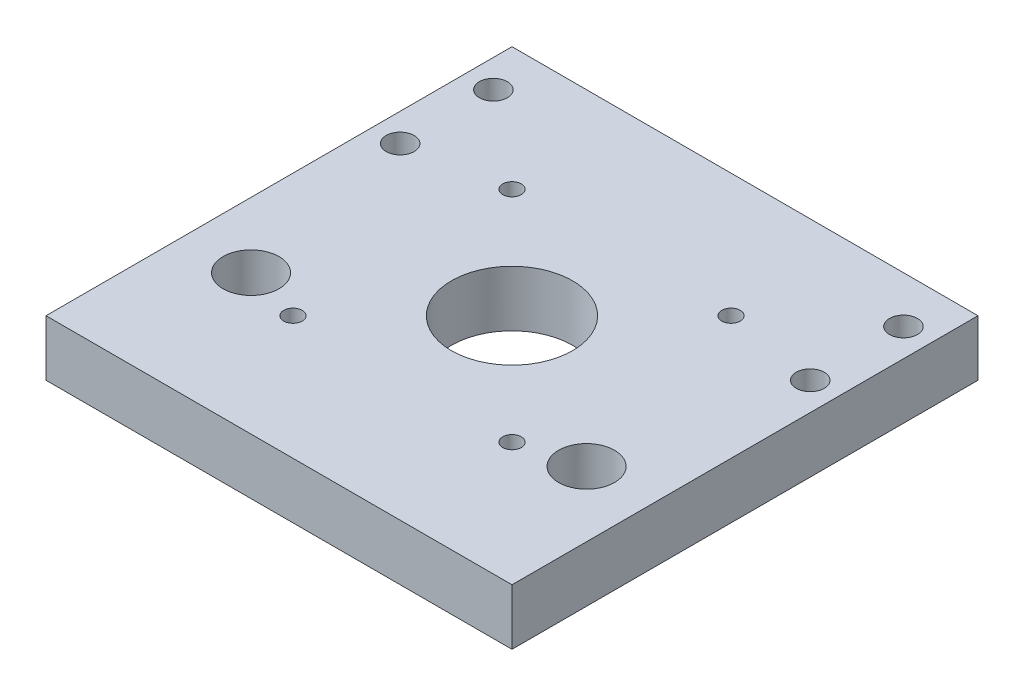
ISO-10303-21;
HEADER;
FILE_DESCRIPTION(('STEP AP214'),'2;1');
FILE_NAME('part.step','',(''),(''),'','','');
FILE_SCHEMA(('AUTOMOTIVE_DESIGN { 1 0 10303 214 1 1 1 1 }'));
ENDSEC;
DATA;
#1=APPLICATION_CONTEXT('core data for automotive mechanical design processes');
#2=APPLICATION_PROTOCOL_DEFINITION('international standard','automotive_design',2000,#1);
#3=PRODUCT_CONTEXT('',#1,'mechanical');
#4=PRODUCT('Part','Part','',(#3));
#5=PRODUCT_RELATED_PRODUCT_CATEGORY('part','',(#4));
#6=PRODUCT_DEFINITION_FORMATION('','',#4);
#7=PRODUCT_DEFINITION_CONTEXT('part definition',#1,'design');
#8=PRODUCT_DEFINITION('design','',#6,#7);
#9=PRODUCT_DEFINITION_SHAPE('','',#8);
#10=(LENGTH_UNIT() NAMED_UNIT(*) SI_UNIT(.MILLI.,.METRE.));
#11=(NAMED_UNIT(*) PLANE_ANGLE_UNIT() SI_UNIT($,.RADIAN.));
#12=(NAMED_UNIT(*) SI_UNIT($,.STERADIAN.) SOLID_ANGLE_UNIT());
#13=UNCERTAINTY_MEASURE_WITH_UNIT(LENGTH_MEASURE(1.E-05),#10,'distance_accuracy_value','');
#14=(GEOMETRIC_REPRESENTATION_CONTEXT(3) GLOBAL_UNCERTAINTY_ASSIGNED_CONTEXT((#13)) GLOBAL_UNIT_ASSIGNED_CONTEXT((#10,
#11,#12)) REPRESENTATION_CONTEXT('',''));
#15=CARTESIAN_POINT('',(0.,0.,0.));
#16=DIRECTION('',(0.,0.,1.));
#17=DIRECTION('',(1.,0.,0.));
#18=AXIS2_PLACEMENT_3D('',#15,#16,#17);
#19=CARTESIAN_POINT('',(50.,12.,70.));
#20=DIRECTION('',(-1.,0.,0.));
#21=DIRECTION('',(0.,0.,1.));
#22=AXIS2_PLACEMENT_3D('',#19,#20,#21);
#23=PLANE('',#22);
#24=DIRECTION('',(0.,0.,-1.));
#25=VECTOR('',#24,1.);
#26=CARTESIAN_POINT('',(50.,0.,70.));
#27=LINE('',#26,#25);
#28=CARTESIAN_POINT('',(50.,0.,70.));
#29=VERTEX_POINT('',#28);
#30=CARTESIAN_POINT('',(50.,0.,-30.));
#31=VERTEX_POINT('',#30);
#32=EDGE_CURVE('E95',#29,#31,#27,.T.);
#33=ORIENTED_EDGE('',*,*,#32,.T.);
#34=DIRECTION('',(0.,-1.,0.));
#35=VECTOR('',#34,1.);
#36=CARTESIAN_POINT('',(50.,12.,-30.));
#37=LINE('',#36,#35);
#38=CARTESIAN_POINT('',(50.,12.,-30.));
#39=VERTEX_POINT('',#38);
#40=EDGE_CURVE('E11',#39,#31,#37,.T.);
#41=ORIENTED_EDGE('',*,*,#40,.F.);
#42=DIRECTION('',(0.,0.,-1.));
#43=VECTOR('',#42,1.);
#44=CARTESIAN_POINT('',(50.,12.,70.));
#45=LINE('',#44,#43);
#46=CARTESIAN_POINT('',(50.,12.,70.));
#47=VERTEX_POINT('',#46);
#48=EDGE_CURVE('E83',#47,#39,#45,.T.);
#49=ORIENTED_EDGE('',*,*,#48,.F.);
#50=DIRECTION('',(0.,-1.,0.));
#51=VECTOR('',#50,1.);
#52=CARTESIAN_POINT('',(50.,12.,70.));
#53=LINE('',#52,#51);
#54=EDGE_CURVE('E91',#47,#29,#53,.T.);
#55=ORIENTED_EDGE('',*,*,#54,.T.);
#56=EDGE_LOOP('',(#33,#41,#49,#55));
#57=FACE_BOUND('',#56,.T.);
#58=ADVANCED_FACE('F32',(#57),#23,.F.);
#59=CARTESIAN_POINT('',(-50.,12.,-30.));
#60=DIRECTION('',(0.,0.,1.));
#61=DIRECTION('',(1.,0.,0.));
#62=AXIS2_PLACEMENT_3D('',#59,#60,#61);
#63=PLANE('',#62);
#64=DIRECTION('',(-1.,0.,0.));
#65=VECTOR('',#64,1.);
#66=CARTESIAN_POINT('',(-50.,0.,-30.));
#67=LINE('',#66,#65);
#68=CARTESIAN_POINT('',(-50.,0.,-30.));
#69=VERTEX_POINT('',#68);
#70=EDGE_CURVE('E87',#31,#69,#67,.T.);
#71=ORIENTED_EDGE('',*,*,#70,.T.);
#72=DIRECTION('',(0.,-1.,0.));
#73=VECTOR('',#72,1.);
#74=CARTESIAN_POINT('',(-50.,12.,-30.));
#75=LINE('',#74,#73);
#76=CARTESIAN_POINT('',(-50.,12.,-30.));
#77=VERTEX_POINT('',#76);
#78=EDGE_CURVE('E40',#77,#69,#75,.T.);
#79=ORIENTED_EDGE('',*,*,#78,.F.);
#80=DIRECTION('',(-1.,0.,0.));
#81=VECTOR('',#80,1.);
#82=CARTESIAN_POINT('',(-50.,12.,-30.));
#83=LINE('',#82,#81);
#84=EDGE_CURVE('E78',#39,#77,#83,.T.);
#85=ORIENTED_EDGE('',*,*,#84,.F.);
#86=ORIENTED_EDGE('',*,*,#40,.T.);
#87=EDGE_LOOP('',(#71,#79,#85,#86));
#88=FACE_BOUND('',#87,.T.);
#89=ADVANCED_FACE('F86',(#88),#63,.F.);
#90=CARTESIAN_POINT('',(-50.,12.,-30.));
#91=DIRECTION('',(1.,0.,0.));
#92=DIRECTION('',(0.,0.,-1.));
#93=AXIS2_PLACEMENT_3D('',#90,#91,#92);
#94=PLANE('',#93);
#95=DIRECTION('',(0.,0.,1.));
#96=VECTOR('',#95,1.);
#97=CARTESIAN_POINT('',(-50.,0.,-30.));
#98=LINE('',#97,#96);
#99=CARTESIAN_POINT('',(-50.,0.,70.));
#100=VERTEX_POINT('',#99);
#101=EDGE_CURVE('E65',#69,#100,#98,.T.);
#102=ORIENTED_EDGE('',*,*,#101,.T.);
#103=DIRECTION('',(0.,-1.,0.));
#104=VECTOR('',#103,1.);
#105=CARTESIAN_POINT('',(-50.,12.,70.));
#106=LINE('',#105,#104);
#107=CARTESIAN_POINT('',(-50.,12.,70.));
#108=VERTEX_POINT('',#107);
#109=EDGE_CURVE('E88',#108,#100,#106,.T.);
#110=ORIENTED_EDGE('',*,*,#109,.F.);
#111=DIRECTION('',(0.,0.,1.));
#112=VECTOR('',#111,1.);
#113=CARTESIAN_POINT('',(-50.,12.,-30.));
#114=LINE('',#113,#112);
#115=EDGE_CURVE('E81',#77,#108,#114,.T.);
#116=ORIENTED_EDGE('',*,*,#115,.F.);
#117=ORIENTED_EDGE('',*,*,#78,.T.);
#118=EDGE_LOOP('',(#102,#110,#116,#117));
#119=FACE_BOUND('',#118,.T.);
#120=ADVANCED_FACE('F89',(#119),#94,.F.);
#121=CARTESIAN_POINT('',(-50.,12.,70.));
#122=DIRECTION('',(0.,0.,-1.));
#123=DIRECTION('',(-1.,0.,0.));
#124=AXIS2_PLACEMENT_3D('',#121,#122,#123);
#125=PLANE('',#124);
#126=DIRECTION('',(1.,0.,0.));
#127=VECTOR('',#126,1.);
#128=CARTESIAN_POINT('',(-50.,0.,70.));
#129=LINE('',#128,#127);
#130=EDGE_CURVE('E71',#100,#29,#129,.T.);
#131=ORIENTED_EDGE('',*,*,#130,.T.);
#132=ORIENTED_EDGE('',*,*,#54,.F.);
#133=DIRECTION('',(1.,0.,0.));
#134=VECTOR('',#133,1.);
#135=CARTESIAN_POINT('',(-50.,12.,70.));
#136=LINE('',#135,#134);
#137=EDGE_CURVE('E48',#108,#47,#136,.T.);
#138=ORIENTED_EDGE('',*,*,#137,.F.);
#139=ORIENTED_EDGE('',*,*,#109,.T.);
#140=EDGE_LOOP('',(#131,#132,#138,#139));
#141=FACE_BOUND('',#140,.T.);
#142=ADVANCED_FACE('F103',(#141),#125,.F.);
#143=CARTESIAN_POINT('',(50.,12.,-30.));
#144=DIRECTION('',(0.,-1.,0.));
#145=DIRECTION('',(0.,0.,-1.));
#146=AXIS2_PLACEMENT_3D('',#143,#144,#145);
#147=PLANE('',#146);
#148=CARTESIAN_POINT('',(36.,12.,40.));
#149=DIRECTION('',(0.,1.,0.));
#150=DIRECTION('',(0.,0.,1.));
#151=AXIS2_PLACEMENT_3D('',#148,#149,#150);
#152=CIRCLE('',#151,6.00000000000001);
#153=CARTESIAN_POINT('',(36.,12.,46.));
#154=VERTEX_POINT('',#153);
#155=EDGE_CURVE('E166',#154,#154,#152,.T.);
#156=ORIENTED_EDGE('',*,*,#155,.F.);
#157=EDGE_LOOP('',(#156));
#158=FACE_BOUND('',#157,.T.);
#159=CARTESIAN_POINT('',(-36.,12.,40.));
#160=DIRECTION('',(0.,1.,0.));
#161=DIRECTION('',(0.,0.,1.));
#162=AXIS2_PLACEMENT_3D('',#159,#160,#161);
#163=CIRCLE('',#162,6.);
#164=CARTESIAN_POINT('',(-36.,12.,46.));
#165=VERTEX_POINT('',#164);
#166=EDGE_CURVE('E160',#165,#165,#163,.T.);
#167=ORIENTED_EDGE('',*,*,#166,.F.);
#168=EDGE_LOOP('',(#167));
#169=FACE_BOUND('',#168,.T.);
#170=CARTESIAN_POINT('',(0.,12.,20.));
#171=DIRECTION('',(0.,1.,0.));
#172=DIRECTION('',(0.,0.,1.));
#173=AXIS2_PLACEMENT_3D('',#170,#171,#172);
#174=CIRCLE('',#173,13.);
#175=CARTESIAN_POINT('',(0.,12.,33.));
#176=VERTEX_POINT('',#175);
#177=EDGE_CURVE('E154',#176,#176,#174,.T.);
#178=ORIENTED_EDGE('',*,*,#177,.F.);
#179=EDGE_LOOP('',(#178));
#180=FACE_BOUND('',#179,.T.);
#181=CARTESIAN_POINT('',(-23.5,12.,-3.49999999999999));
#182=DIRECTION('',(0.,1.,0.));
#183=DIRECTION('',(0.,0.,1.));
#184=AXIS2_PLACEMENT_3D('',#181,#182,#183);
#185=CIRCLE('',#184,2.00000000000001);
#186=CARTESIAN_POINT('',(-23.5,12.,-1.49999999999998));
#187=VERTEX_POINT('',#186);
#188=EDGE_CURVE('E148',#187,#187,#185,.T.);
#189=ORIENTED_EDGE('',*,*,#188,.F.);
#190=EDGE_LOOP('',(#189));
#191=FACE_BOUND('',#190,.T.);
#192=CARTESIAN_POINT('',(23.5,12.,-3.5));
#193=DIRECTION('',(0.,1.,0.));
#194=DIRECTION('',(0.,0.,1.));
#195=AXIS2_PLACEMENT_3D('',#192,#193,#194);
#196=CIRCLE('',#195,2.00000000000001);
#197=CARTESIAN_POINT('',(23.5,12.,-1.49999999999999));
#198=VERTEX_POINT('',#197);
#199=EDGE_CURVE('E142',#198,#198,#196,.T.);
#200=ORIENTED_EDGE('',*,*,#199,.F.);
#201=EDGE_LOOP('',(#200));
#202=FACE_BOUND('',#201,.T.);
#203=CARTESIAN_POINT('',(23.5,12.,43.5));
#204=DIRECTION('',(0.,1.,0.));
#205=DIRECTION('',(0.,0.,1.));
#206=AXIS2_PLACEMENT_3D('',#203,#204,#205);
#207=CIRCLE('',#206,2.00000000000001);
#208=CARTESIAN_POINT('',(23.5,12.,45.5));
#209=VERTEX_POINT('',#208);
#210=EDGE_CURVE('E136',#209,#209,#207,.T.);
#211=ORIENTED_EDGE('',*,*,#210,.F.);
#212=EDGE_LOOP('',(#211));
#213=FACE_BOUND('',#212,.T.);
#214=CARTESIAN_POINT('',(-23.5,12.,43.5));
#215=DIRECTION('',(0.,1.,0.));
#216=DIRECTION('',(0.,0.,1.));
#217=AXIS2_PLACEMENT_3D('',#214,#215,#216);
#218=CIRCLE('',#217,2.00000000000001);
#219=CARTESIAN_POINT('',(-23.5,12.,45.5));
#220=VERTEX_POINT('',#219);
#221=EDGE_CURVE('E130',#220,#220,#218,.T.);
#222=ORIENTED_EDGE('',*,*,#221,.F.);
#223=EDGE_LOOP('',(#222));
#224=FACE_BOUND('',#223,.T.);
#225=CARTESIAN_POINT('',(44.,12.,0.));
#226=DIRECTION('',(0.,1.,0.));
#227=DIRECTION('',(0.,0.,1.));
#228=AXIS2_PLACEMENT_3D('',#225,#226,#227);
#229=CIRCLE('',#228,2.99999999999999);
#230=CARTESIAN_POINT('',(44.,12.,3.));
#231=VERTEX_POINT('',#230);
#232=EDGE_CURVE('E124',#231,#231,#229,.T.);
#233=ORIENTED_EDGE('',*,*,#232,.F.);
#234=EDGE_LOOP('',(#233));
#235=FACE_BOUND('',#234,.T.);
#236=CARTESIAN_POINT('',(44.,12.,-20.));
#237=DIRECTION('',(0.,1.,0.));
#238=DIRECTION('',(0.,0.,1.));
#239=AXIS2_PLACEMENT_3D('',#236,#237,#238);
#240=CIRCLE('',#239,3.);
#241=CARTESIAN_POINT('',(44.,12.,-17.));
#242=VERTEX_POINT('',#241);
#243=EDGE_CURVE('E118',#242,#242,#240,.T.);
#244=ORIENTED_EDGE('',*,*,#243,.F.);
#245=EDGE_LOOP('',(#244));
#246=FACE_BOUND('',#245,.T.);
#247=CARTESIAN_POINT('',(-44.,12.,0.));
#248=DIRECTION('',(0.,1.,0.));
#249=DIRECTION('',(0.,0.,1.));
#250=AXIS2_PLACEMENT_3D('',#247,#248,#249);
#251=CIRCLE('',#250,3.);
#252=CARTESIAN_POINT('',(-44.,12.,3.));
#253=VERTEX_POINT('',#252);
#254=EDGE_CURVE('E112',#253,#253,#251,.T.);
#255=ORIENTED_EDGE('',*,*,#254,.F.);
#256=EDGE_LOOP('',(#255));
#257=FACE_BOUND('',#256,.T.);
#258=CARTESIAN_POINT('',(-44.,12.,-20.));
#259=DIRECTION('',(0.,1.,0.));
#260=DIRECTION('',(0.,0.,1.));
#261=AXIS2_PLACEMENT_3D('',#258,#259,#260);
#262=CIRCLE('',#261,2.99999999999999);
#263=CARTESIAN_POINT('',(-44.,12.,-17.));
#264=VERTEX_POINT('',#263);
#265=EDGE_CURVE('E98',#264,#264,#262,.T.);
#266=ORIENTED_EDGE('',*,*,#265,.F.);
#267=EDGE_LOOP('',(#266));
#268=FACE_BOUND('',#267,.T.);
#269=ORIENTED_EDGE('',*,*,#48,.T.);
#270=ORIENTED_EDGE('',*,*,#84,.T.);
#271=ORIENTED_EDGE('',*,*,#115,.T.);
#272=ORIENTED_EDGE('',*,*,#137,.T.);
#273=EDGE_LOOP('',(#269,#270,#271,#272));
#274=FACE_BOUND('',#273,.T.);
#275=ADVANCED_FACE('F79',(#158,#169,#180,#191,#202,#213,#224,#235,#246,#257,#268,#274),#147,.F.);
#276=CARTESIAN_POINT('',(50.,0.,-30.));
#277=DIRECTION('',(0.,-1.,0.));
#278=DIRECTION('',(0.,0.,-1.));
#279=AXIS2_PLACEMENT_3D('',#276,#277,#278);
#280=PLANE('',#279);
#281=CARTESIAN_POINT('',(36.,0.,40.));
#282=DIRECTION('',(0.,-1.,0.));
#283=DIRECTION('',(0.,0.,-1.));
#284=AXIS2_PLACEMENT_3D('',#281,#282,#283);
#285=CIRCLE('',#284,6.00000000000001);
#286=CARTESIAN_POINT('',(36.,0.,34.));
#287=VERTEX_POINT('',#286);
#288=EDGE_CURVE('E169',#287,#287,#285,.F.);
#289=ORIENTED_EDGE('',*,*,#288,.T.);
#290=EDGE_LOOP('',(#289));
#291=FACE_BOUND('',#290,.T.);
#292=CARTESIAN_POINT('',(-36.,0.,40.));
#293=DIRECTION('',(0.,-1.,0.));
#294=DIRECTION('',(0.,0.,-1.));
#295=AXIS2_PLACEMENT_3D('',#292,#293,#294);
#296=CIRCLE('',#295,6.);
#297=CARTESIAN_POINT('',(-36.,0.,34.));
#298=VERTEX_POINT('',#297);
#299=EDGE_CURVE('E163',#298,#298,#296,.F.);
#300=ORIENTED_EDGE('',*,*,#299,.T.);
#301=EDGE_LOOP('',(#300));
#302=FACE_BOUND('',#301,.T.);
#303=CARTESIAN_POINT('',(0.,0.,20.));
#304=DIRECTION('',(0.,-1.,0.));
#305=DIRECTION('',(0.,0.,-1.));
#306=AXIS2_PLACEMENT_3D('',#303,#304,#305);
#307=CIRCLE('',#306,13.);
#308=CARTESIAN_POINT('',(0.,0.,7.));
#309=VERTEX_POINT('',#308);
#310=EDGE_CURVE('E157',#309,#309,#307,.F.);
#311=ORIENTED_EDGE('',*,*,#310,.T.);
#312=EDGE_LOOP('',(#311));
#313=FACE_BOUND('',#312,.T.);
#314=CARTESIAN_POINT('',(-23.5,0.,-3.49999999999999));
#315=DIRECTION('',(0.,-1.,0.));
#316=DIRECTION('',(0.,0.,-1.));
#317=AXIS2_PLACEMENT_3D('',#314,#315,#316);
#318=CIRCLE('',#317,2.00000000000001);
#319=CARTESIAN_POINT('',(-23.5,0.,-5.5));
#320=VERTEX_POINT('',#319);
#321=EDGE_CURVE('E151',#320,#320,#318,.F.);
#322=ORIENTED_EDGE('',*,*,#321,.T.);
#323=EDGE_LOOP('',(#322));
#324=FACE_BOUND('',#323,.T.);
#325=CARTESIAN_POINT('',(23.5,0.,-3.5));
#326=DIRECTION('',(0.,-1.,0.));
#327=DIRECTION('',(0.,0.,-1.));
#328=AXIS2_PLACEMENT_3D('',#325,#326,#327);
#329=CIRCLE('',#328,2.00000000000001);
#330=CARTESIAN_POINT('',(23.5,0.,-5.5));
#331=VERTEX_POINT('',#330);
#332=EDGE_CURVE('E145',#331,#331,#329,.F.);
#333=ORIENTED_EDGE('',*,*,#332,.T.);
#334=EDGE_LOOP('',(#333));
#335=FACE_BOUND('',#334,.T.);
#336=CARTESIAN_POINT('',(23.5,0.,43.5));
#337=DIRECTION('',(0.,-1.,0.));
#338=DIRECTION('',(0.,0.,-1.));
#339=AXIS2_PLACEMENT_3D('',#336,#337,#338);
#340=CIRCLE('',#339,2.00000000000001);
#341=CARTESIAN_POINT('',(23.5,0.,41.5));
#342=VERTEX_POINT('',#341);
#343=EDGE_CURVE('E139',#342,#342,#340,.F.);
#344=ORIENTED_EDGE('',*,*,#343,.T.);
#345=EDGE_LOOP('',(#344));
#346=FACE_BOUND('',#345,.T.);
#347=CARTESIAN_POINT('',(-23.5,0.,43.5));
#348=DIRECTION('',(0.,-1.,0.));
#349=DIRECTION('',(0.,0.,-1.));
#350=AXIS2_PLACEMENT_3D('',#347,#348,#349);
#351=CIRCLE('',#350,2.00000000000001);
#352=CARTESIAN_POINT('',(-23.5,0.,41.5));
#353=VERTEX_POINT('',#352);
#354=EDGE_CURVE('E133',#353,#353,#351,.F.);
#355=ORIENTED_EDGE('',*,*,#354,.T.);
#356=EDGE_LOOP('',(#355));
#357=FACE_BOUND('',#356,.T.);
#358=CARTESIAN_POINT('',(44.,0.,0.));
#359=DIRECTION('',(0.,-1.,0.));
#360=DIRECTION('',(0.,0.,-1.));
#361=AXIS2_PLACEMENT_3D('',#358,#359,#360);
#362=CIRCLE('',#361,2.99999999999999);
#363=CARTESIAN_POINT('',(44.,0.,-2.99999999999999));
#364=VERTEX_POINT('',#363);
#365=EDGE_CURVE('E127',#364,#364,#362,.F.);
#366=ORIENTED_EDGE('',*,*,#365,.T.);
#367=EDGE_LOOP('',(#366));
#368=FACE_BOUND('',#367,.T.);
#369=CARTESIAN_POINT('',(44.,0.,-20.));
#370=DIRECTION('',(0.,-1.,0.));
#371=DIRECTION('',(0.,0.,-1.));
#372=AXIS2_PLACEMENT_3D('',#369,#370,#371);
#373=CIRCLE('',#372,3.);
#374=CARTESIAN_POINT('',(44.,0.,-23.));
#375=VERTEX_POINT('',#374);
#376=EDGE_CURVE('E121',#375,#375,#373,.F.);
#377=ORIENTED_EDGE('',*,*,#376,.T.);
#378=EDGE_LOOP('',(#377));
#379=FACE_BOUND('',#378,.T.);
#380=CARTESIAN_POINT('',(-44.,0.,0.));
#381=DIRECTION('',(0.,-1.,0.));
#382=DIRECTION('',(0.,0.,-1.));
#383=AXIS2_PLACEMENT_3D('',#380,#381,#382);
#384=CIRCLE('',#383,3.);
#385=CARTESIAN_POINT('',(-44.,0.,-3.));
#386=VERTEX_POINT('',#385);
#387=EDGE_CURVE('E115',#386,#386,#384,.F.);
#388=ORIENTED_EDGE('',*,*,#387,.T.);
#389=EDGE_LOOP('',(#388));
#390=FACE_BOUND('',#389,.T.);
#391=CARTESIAN_POINT('',(-44.,0.,-20.));
#392=DIRECTION('',(0.,-1.,0.));
#393=DIRECTION('',(0.,0.,-1.));
#394=AXIS2_PLACEMENT_3D('',#391,#392,#393);
#395=CIRCLE('',#394,2.99999999999999);
#396=CARTESIAN_POINT('',(-44.,0.,-23.));
#397=VERTEX_POINT('',#396);
#398=EDGE_CURVE('E109',#397,#397,#395,.F.);
#399=ORIENTED_EDGE('',*,*,#398,.T.);
#400=EDGE_LOOP('',(#399));
#401=FACE_BOUND('',#400,.T.);
#402=ORIENTED_EDGE('',*,*,#32,.F.);
#403=ORIENTED_EDGE('',*,*,#130,.F.);
#404=ORIENTED_EDGE('',*,*,#101,.F.);
#405=ORIENTED_EDGE('',*,*,#70,.F.);
#406=EDGE_LOOP('',(#402,#403,#404,#405));
#407=FACE_BOUND('',#406,.T.);
#408=ADVANCED_FACE('F106',(#291,#302,#313,#324,#335,#346,#357,#368,#379,#390,#401,#407),#280,.T.);
#409=CARTESIAN_POINT('',(-44.,-0.000999999999999265,-20.));
#410=DIRECTION('',(0.,1.,0.));
#411=DIRECTION('',(0.,0.,1.));
#412=AXIS2_PLACEMENT_3D('',#409,#410,#411);
#413=CYLINDRICAL_SURFACE('',#412,2.99999999999999);
#414=ORIENTED_EDGE('',*,*,#398,.F.);
#415=EDGE_LOOP('',(#414));
#416=FACE_BOUND('',#415,.T.);
#417=ORIENTED_EDGE('',*,*,#265,.T.);
#418=EDGE_LOOP('',(#417));
#419=FACE_BOUND('',#418,.T.);
#420=ADVANCED_FACE('F200',(#416,#419),#413,.F.);
#421=CARTESIAN_POINT('',(-44.,-0.000999999999999265,0.));
#422=DIRECTION('',(0.,1.,0.));
#423=DIRECTION('',(0.,0.,1.));
#424=AXIS2_PLACEMENT_3D('',#421,#422,#423);
#425=CYLINDRICAL_SURFACE('',#424,3.);
#426=ORIENTED_EDGE('',*,*,#387,.F.);
#427=EDGE_LOOP('',(#426));
#428=FACE_BOUND('',#427,.T.);
#429=ORIENTED_EDGE('',*,*,#254,.T.);
#430=EDGE_LOOP('',(#429));
#431=FACE_BOUND('',#430,.T.);
#432=ADVANCED_FACE('F202',(#428,#431),#425,.F.);
#433=CARTESIAN_POINT('',(44.,-0.000999999999999265,-20.));
#434=DIRECTION('',(0.,1.,0.));
#435=DIRECTION('',(0.,0.,1.));
#436=AXIS2_PLACEMENT_3D('',#433,#434,#435);
#437=CYLINDRICAL_SURFACE('',#436,3.);
#438=ORIENTED_EDGE('',*,*,#376,.F.);
#439=EDGE_LOOP('',(#438));
#440=FACE_BOUND('',#439,.T.);
#441=ORIENTED_EDGE('',*,*,#243,.T.);
#442=EDGE_LOOP('',(#441));
#443=FACE_BOUND('',#442,.T.);
#444=ADVANCED_FACE('F209',(#440,#443),#437,.F.);
#445=CARTESIAN_POINT('',(44.,-0.000999999999999265,0.));
#446=DIRECTION('',(0.,1.,0.));
#447=DIRECTION('',(0.,0.,1.));
#448=AXIS2_PLACEMENT_3D('',#445,#446,#447);
#449=CYLINDRICAL_SURFACE('',#448,2.99999999999999);
#450=ORIENTED_EDGE('',*,*,#365,.F.);
#451=EDGE_LOOP('',(#450));
#452=FACE_BOUND('',#451,.T.);
#453=ORIENTED_EDGE('',*,*,#232,.T.);
#454=EDGE_LOOP('',(#453));
#455=FACE_BOUND('',#454,.T.);
#456=ADVANCED_FACE('F284',(#452,#455),#449,.F.);
#457=CARTESIAN_POINT('',(-23.5,-0.000999999999999265,43.5));
#458=DIRECTION('',(0.,1.,0.));
#459=DIRECTION('',(0.,0.,1.));
#460=AXIS2_PLACEMENT_3D('',#457,#458,#459);
#461=CYLINDRICAL_SURFACE('',#460,2.00000000000001);
#462=ORIENTED_EDGE('',*,*,#354,.F.);
#463=EDGE_LOOP('',(#462));
#464=FACE_BOUND('',#463,.T.);
#465=ORIENTED_EDGE('',*,*,#221,.T.);
#466=EDGE_LOOP('',(#465));
#467=FACE_BOUND('',#466,.T.);
#468=ADVANCED_FACE('F280',(#464,#467),#461,.F.);
#469=CARTESIAN_POINT('',(23.5,-0.000999999999999265,43.5));
#470=DIRECTION('',(0.,1.,0.));
#471=DIRECTION('',(0.,0.,1.));
#472=AXIS2_PLACEMENT_3D('',#469,#470,#471);
#473=CYLINDRICAL_SURFACE('',#472,2.00000000000001);
#474=ORIENTED_EDGE('',*,*,#343,.F.);
#475=EDGE_LOOP('',(#474));
#476=FACE_BOUND('',#475,.T.);
#477=ORIENTED_EDGE('',*,*,#210,.T.);
#478=EDGE_LOOP('',(#477));
#479=FACE_BOUND('',#478,.T.);
#480=ADVANCED_FACE('F276',(#476,#479),#473,.F.);
#481=CARTESIAN_POINT('',(23.5,-0.000999999999999265,-3.5));
#482=DIRECTION('',(0.,1.,0.));
#483=DIRECTION('',(0.,0.,1.));
#484=AXIS2_PLACEMENT_3D('',#481,#482,#483);
#485=CYLINDRICAL_SURFACE('',#484,2.00000000000001);
#486=ORIENTED_EDGE('',*,*,#332,.F.);
#487=EDGE_LOOP('',(#486));
#488=FACE_BOUND('',#487,.T.);
#489=ORIENTED_EDGE('',*,*,#199,.T.);
#490=EDGE_LOOP('',(#489));
#491=FACE_BOUND('',#490,.T.);
#492=ADVANCED_FACE('F272',(#488,#491),#485,.F.);
#493=CARTESIAN_POINT('',(-23.5,-0.000999999999999265,-3.49999999999999));
#494=DIRECTION('',(0.,1.,0.));
#495=DIRECTION('',(0.,0.,1.));
#496=AXIS2_PLACEMENT_3D('',#493,#494,#495);
#497=CYLINDRICAL_SURFACE('',#496,2.00000000000001);
#498=ORIENTED_EDGE('',*,*,#321,.F.);
#499=EDGE_LOOP('',(#498));
#500=FACE_BOUND('',#499,.T.);
#501=ORIENTED_EDGE('',*,*,#188,.T.);
#502=EDGE_LOOP('',(#501));
#503=FACE_BOUND('',#502,.T.);
#504=ADVANCED_FACE('F268',(#500,#503),#497,.F.);
#505=CARTESIAN_POINT('',(0.,-0.000999999999999265,20.));
#506=DIRECTION('',(0.,1.,0.));
#507=DIRECTION('',(0.,0.,1.));
#508=AXIS2_PLACEMENT_3D('',#505,#506,#507);
#509=CYLINDRICAL_SURFACE('',#508,13.);
#510=ORIENTED_EDGE('',*,*,#310,.F.);
#511=EDGE_LOOP('',(#510));
#512=FACE_BOUND('',#511,.T.);
#513=ORIENTED_EDGE('',*,*,#177,.T.);
#514=EDGE_LOOP('',(#513));
#515=FACE_BOUND('',#514,.T.);
#516=ADVANCED_FACE('F249',(#512,#515),#509,.F.);
#517=CARTESIAN_POINT('',(-36.,-0.000999999999999265,40.));
#518=DIRECTION('',(0.,1.,0.));
#519=DIRECTION('',(0.,0.,1.));
#520=AXIS2_PLACEMENT_3D('',#517,#518,#519);
#521=CYLINDRICAL_SURFACE('',#520,6.);
#522=ORIENTED_EDGE('',*,*,#299,.F.);
#523=EDGE_LOOP('',(#522));
#524=FACE_BOUND('',#523,.T.);
#525=ORIENTED_EDGE('',*,*,#166,.T.);
#526=EDGE_LOOP('',(#525));
#527=FACE_BOUND('',#526,.T.);
#528=ADVANCED_FACE('F244',(#524,#527),#521,.F.);
#529=CARTESIAN_POINT('',(36.,-0.000999999999999265,40.));
#530=DIRECTION('',(0.,1.,0.));
#531=DIRECTION('',(0.,0.,1.));
#532=AXIS2_PLACEMENT_3D('',#529,#530,#531);
#533=CYLINDRICAL_SURFACE('',#532,6.00000000000001);
#534=ORIENTED_EDGE('',*,*,#288,.F.);
#535=EDGE_LOOP('',(#534));
#536=FACE_BOUND('',#535,.T.);
#537=ORIENTED_EDGE('',*,*,#155,.T.);
#538=EDGE_LOOP('',(#537));
#539=FACE_BOUND('',#538,.T.);
#540=ADVANCED_FACE('F175',(#536,#539),#533,.F.);
#541=CLOSED_SHELL('',(#58,#89,#120,#142,#275,#408,#420,#432,#444,#456,#468,#480,#492,#504,#516,
#528,#540));
#542=MANIFOLD_SOLID_BREP('B2',#541);
#543=ADVANCED_BREP_SHAPE_REPRESENTATION('',(#18,#542),#14);
#544=SHAPE_DEFINITION_REPRESENTATION(#9,#543);
ENDSEC;
END-ISO-10303-21;
